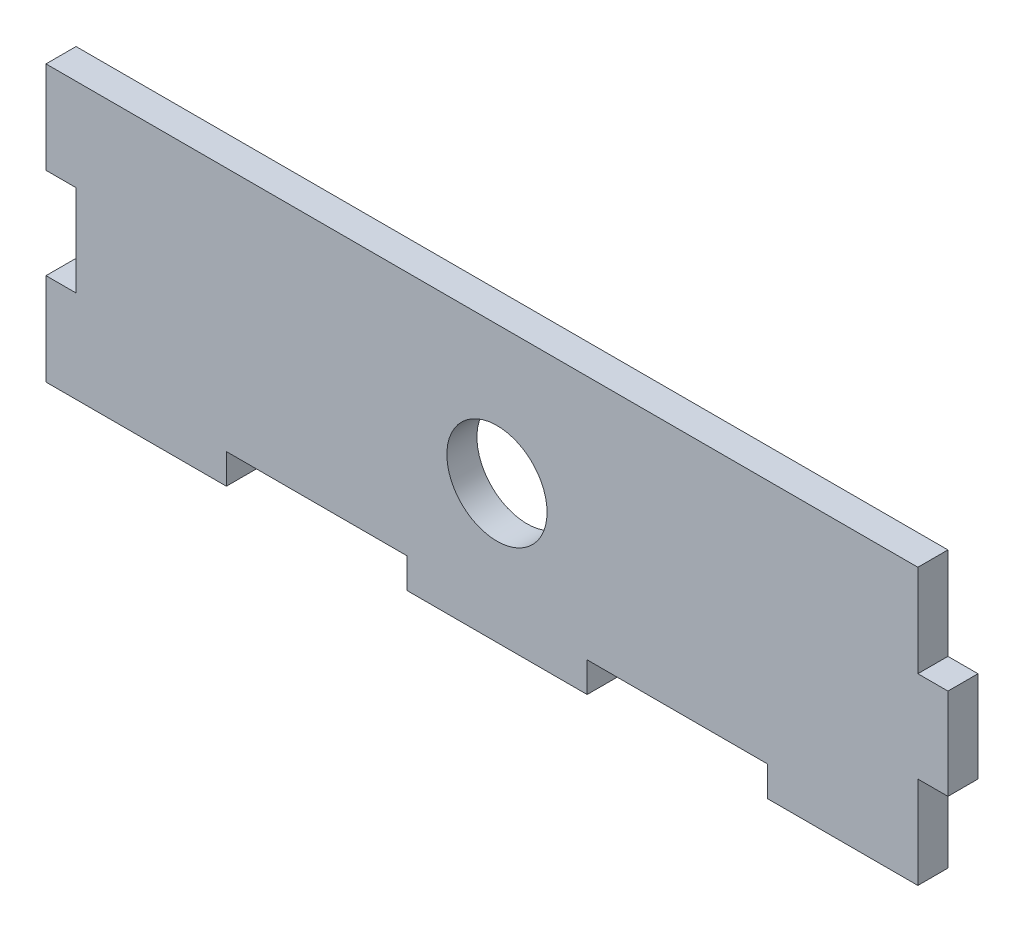
ISO-10303-21;
HEADER;
FILE_DESCRIPTION(('STEP AP214'),'2;1');
FILE_NAME('part.step','',(''),(''),'','','');
FILE_SCHEMA(('AUTOMOTIVE_DESIGN { 1 0 10303 214 1 1 1 1 }'));
ENDSEC;
DATA;
#1=APPLICATION_CONTEXT('core data for automotive mechanical design processes');
#2=APPLICATION_PROTOCOL_DEFINITION('international standard','automotive_design',2000,#1);
#3=PRODUCT_CONTEXT('',#1,'mechanical');
#4=PRODUCT('Part','Part','',(#3));
#5=PRODUCT_RELATED_PRODUCT_CATEGORY('part','',(#4));
#6=PRODUCT_DEFINITION_FORMATION('','',#4);
#7=PRODUCT_DEFINITION_CONTEXT('part definition',#1,'design');
#8=PRODUCT_DEFINITION('design','',#6,#7);
#9=PRODUCT_DEFINITION_SHAPE('','',#8);
#10=(LENGTH_UNIT() NAMED_UNIT(*) SI_UNIT(.MILLI.,.METRE.));
#11=(NAMED_UNIT(*) PLANE_ANGLE_UNIT() SI_UNIT($,.RADIAN.));
#12=(NAMED_UNIT(*) SI_UNIT($,.STERADIAN.) SOLID_ANGLE_UNIT());
#13=UNCERTAINTY_MEASURE_WITH_UNIT(LENGTH_MEASURE(1.E-05),#10,'distance_accuracy_value','');
#14=(GEOMETRIC_REPRESENTATION_CONTEXT(3) GLOBAL_UNCERTAINTY_ASSIGNED_CONTEXT((#13)) GLOBAL_UNIT_ASSIGNED_CONTEXT((#10,
#11,#12)) REPRESENTATION_CONTEXT('',''));
#15=CARTESIAN_POINT('',(0.,0.,0.));
#16=DIRECTION('',(0.,0.,1.));
#17=DIRECTION('',(1.,0.,0.));
#18=AXIS2_PLACEMENT_3D('',#15,#16,#17);
#19=CARTESIAN_POINT('',(9.00000000000001,0.,3.));
#20=DIRECTION('',(1.,0.,0.));
#21=DIRECTION('',(0.,0.,-1.));
#22=AXIS2_PLACEMENT_3D('',#19,#20,#21);
#23=PLANE('',#22);
#24=DIRECTION('',(0.,-1.,0.));
#25=VECTOR('',#24,1.);
#26=CARTESIAN_POINT('',(9.00000000000001,0.,0.));
#27=LINE('',#26,#25);
#28=CARTESIAN_POINT('',(9.00000000000001,-10.75,0.));
#29=VERTEX_POINT('',#28);
#30=CARTESIAN_POINT('',(9.00000000000001,-13.75,0.));
#31=VERTEX_POINT('',#30);
#32=EDGE_CURVE('E247',#29,#31,#27,.T.);
#33=ORIENTED_EDGE('',*,*,#32,.F.);
#34=DIRECTION('',(0.,0.,-1.));
#35=VECTOR('',#34,1.);
#36=CARTESIAN_POINT('',(9.00000000000001,-10.75,3.));
#37=LINE('',#36,#35);
#38=CARTESIAN_POINT('',(9.00000000000001,-10.75,3.));
#39=VERTEX_POINT('',#38);
#40=EDGE_CURVE('E11',#39,#29,#37,.T.);
#41=ORIENTED_EDGE('',*,*,#40,.F.);
#42=DIRECTION('',(0.,-1.,0.));
#43=VECTOR('',#42,1.);
#44=CARTESIAN_POINT('',(9.00000000000001,0.,3.));
#45=LINE('',#44,#43);
#46=CARTESIAN_POINT('',(9.00000000000001,-13.75,3.));
#47=VERTEX_POINT('',#46);
#48=EDGE_CURVE('E307',#39,#47,#45,.T.);
#49=ORIENTED_EDGE('',*,*,#48,.T.);
#50=DIRECTION('',(0.,0.,-1.));
#51=VECTOR('',#50,1.);
#52=CARTESIAN_POINT('',(9.00000000000001,-13.75,3.));
#53=LINE('',#52,#51);
#54=EDGE_CURVE('E121',#47,#31,#53,.T.);
#55=ORIENTED_EDGE('',*,*,#54,.T.);
#56=EDGE_LOOP('',(#33,#41,#49,#55));
#57=FACE_BOUND('',#56,.T.);
#58=ADVANCED_FACE('F34',(#57),#23,.T.);
#59=CARTESIAN_POINT('',(0.,-10.75,3.));
#60=DIRECTION('',(0.,-1.,0.));
#61=DIRECTION('',(1.,0.,0.));
#62=AXIS2_PLACEMENT_3D('',#59,#60,#61);
#63=PLANE('',#62);
#64=DIRECTION('',(-1.,0.,0.));
#65=VECTOR('',#64,1.);
#66=CARTESIAN_POINT('',(0.,-10.75,0.));
#67=LINE('',#66,#65);
#68=CARTESIAN_POINT('',(27.,-10.75,0.));
#69=VERTEX_POINT('',#68);
#70=EDGE_CURVE('E245',#69,#29,#67,.T.);
#71=ORIENTED_EDGE('',*,*,#70,.F.);
#72=DIRECTION('',(0.,0.,-1.));
#73=VECTOR('',#72,1.);
#74=CARTESIAN_POINT('',(27.,-10.75,3.));
#75=LINE('',#74,#73);
#76=CARTESIAN_POINT('',(27.,-10.75,3.));
#77=VERTEX_POINT('',#76);
#78=EDGE_CURVE('E43',#77,#69,#75,.T.);
#79=ORIENTED_EDGE('',*,*,#78,.F.);
#80=DIRECTION('',(-1.,0.,0.));
#81=VECTOR('',#80,1.);
#82=CARTESIAN_POINT('',(0.,-10.75,3.));
#83=LINE('',#82,#81);
#84=EDGE_CURVE('E306',#77,#39,#83,.T.);
#85=ORIENTED_EDGE('',*,*,#84,.T.);
#86=ORIENTED_EDGE('',*,*,#40,.T.);
#87=EDGE_LOOP('',(#71,#79,#85,#86));
#88=FACE_BOUND('',#87,.T.);
#89=ADVANCED_FACE('F246',(#88),#63,.T.);
#90=CARTESIAN_POINT('',(27.,0.,3.));
#91=DIRECTION('',(-1.,0.,0.));
#92=DIRECTION('',(0.,0.,1.));
#93=AXIS2_PLACEMENT_3D('',#90,#91,#92);
#94=PLANE('',#93);
#95=DIRECTION('',(0.,1.,0.));
#96=VECTOR('',#95,1.);
#97=CARTESIAN_POINT('',(27.,0.,0.));
#98=LINE('',#97,#96);
#99=CARTESIAN_POINT('',(27.,-13.75,0.));
#100=VERTEX_POINT('',#99);
#101=EDGE_CURVE('E238',#100,#69,#98,.T.);
#102=ORIENTED_EDGE('',*,*,#101,.F.);
#103=DIRECTION('',(0.,0.,-1.));
#104=VECTOR('',#103,1.);
#105=CARTESIAN_POINT('',(27.,-13.75,3.));
#106=LINE('',#105,#104);
#107=CARTESIAN_POINT('',(27.,-13.75,3.));
#108=VERTEX_POINT('',#107);
#109=EDGE_CURVE('E231',#108,#100,#106,.T.);
#110=ORIENTED_EDGE('',*,*,#109,.F.);
#111=DIRECTION('',(0.,1.,0.));
#112=VECTOR('',#111,1.);
#113=CARTESIAN_POINT('',(27.,0.,3.));
#114=LINE('',#113,#112);
#115=EDGE_CURVE('E240',#108,#77,#114,.T.);
#116=ORIENTED_EDGE('',*,*,#115,.T.);
#117=ORIENTED_EDGE('',*,*,#78,.T.);
#118=EDGE_LOOP('',(#102,#110,#116,#117));
#119=FACE_BOUND('',#118,.T.);
#120=ADVANCED_FACE('F236',(#119),#94,.T.);
#121=CARTESIAN_POINT('',(0.,-13.75,3.));
#122=DIRECTION('',(0.,1.,0.));
#123=DIRECTION('',(0.,0.,1.));
#124=AXIS2_PLACEMENT_3D('',#121,#122,#123);
#125=PLANE('',#124);
#126=DIRECTION('',(1.,0.,0.));
#127=VECTOR('',#126,1.);
#128=CARTESIAN_POINT('',(0.,-13.75,0.));
#129=LINE('',#128,#127);
#130=CARTESIAN_POINT('',(42.,-13.75,0.));
#131=VERTEX_POINT('',#130);
#132=EDGE_CURVE('E253',#100,#131,#129,.T.);
#133=ORIENTED_EDGE('',*,*,#132,.T.);
#134=DIRECTION('',(0.,0.,-1.));
#135=VECTOR('',#134,1.);
#136=CARTESIAN_POINT('',(42.,-13.75,3.));
#137=LINE('',#136,#135);
#138=CARTESIAN_POINT('',(42.,-13.75,3.));
#139=VERTEX_POINT('',#138);
#140=EDGE_CURVE('E229',#139,#131,#137,.T.);
#141=ORIENTED_EDGE('',*,*,#140,.F.);
#142=DIRECTION('',(1.,0.,0.));
#143=VECTOR('',#142,1.);
#144=CARTESIAN_POINT('',(0.,-13.75,3.));
#145=LINE('',#144,#143);
#146=EDGE_CURVE('E296',#108,#139,#145,.T.);
#147=ORIENTED_EDGE('',*,*,#146,.F.);
#148=ORIENTED_EDGE('',*,*,#109,.T.);
#149=EDGE_LOOP('',(#133,#141,#147,#148));
#150=FACE_BOUND('',#149,.T.);
#151=ADVANCED_FACE('F379',(#150),#125,.F.);
#152=CARTESIAN_POINT('',(42.,0.,3.));
#153=DIRECTION('',(1.,0.,0.));
#154=DIRECTION('',(0.,0.,-1.));
#155=AXIS2_PLACEMENT_3D('',#152,#153,#154);
#156=PLANE('',#155);
#157=DIRECTION('',(0.,-1.,0.));
#158=VECTOR('',#157,1.);
#159=CARTESIAN_POINT('',(42.,0.,0.));
#160=LINE('',#159,#158);
#161=CARTESIAN_POINT('',(42.,-4.55,0.));
#162=VERTEX_POINT('',#161);
#163=EDGE_CURVE('E255',#162,#131,#160,.T.);
#164=ORIENTED_EDGE('',*,*,#163,.F.);
#165=DIRECTION('',(0.,0.,-1.));
#166=VECTOR('',#165,1.);
#167=CARTESIAN_POINT('',(42.,-4.55,3.));
#168=LINE('',#167,#166);
#169=CARTESIAN_POINT('',(42.,-4.55,3.));
#170=VERTEX_POINT('',#169);
#171=EDGE_CURVE('E227',#170,#162,#168,.T.);
#172=ORIENTED_EDGE('',*,*,#171,.F.);
#173=DIRECTION('',(0.,-1.,0.));
#174=VECTOR('',#173,1.);
#175=CARTESIAN_POINT('',(42.,0.,3.));
#176=LINE('',#175,#174);
#177=EDGE_CURVE('E300',#170,#139,#176,.T.);
#178=ORIENTED_EDGE('',*,*,#177,.T.);
#179=ORIENTED_EDGE('',*,*,#140,.T.);
#180=EDGE_LOOP('',(#164,#172,#178,#179));
#181=FACE_BOUND('',#180,.T.);
#182=ADVANCED_FACE('F377',(#181),#156,.T.);
#183=CARTESIAN_POINT('',(0.,-4.55000000000001,3.));
#184=DIRECTION('',(0.,-1.,0.));
#185=DIRECTION('',(1.,0.,0.));
#186=AXIS2_PLACEMENT_3D('',#183,#184,#185);
#187=PLANE('',#186);
#188=DIRECTION('',(-1.,0.,0.));
#189=VECTOR('',#188,1.);
#190=CARTESIAN_POINT('',(0.,-4.55000000000001,0.));
#191=LINE('',#190,#189);
#192=CARTESIAN_POINT('',(45.,-4.55,0.));
#193=VERTEX_POINT('',#192);
#194=EDGE_CURVE('E261',#193,#162,#191,.T.);
#195=ORIENTED_EDGE('',*,*,#194,.F.);
#196=DIRECTION('',(0.,0.,-1.));
#197=VECTOR('',#196,1.);
#198=CARTESIAN_POINT('',(45.,-4.55,3.));
#199=LINE('',#198,#197);
#200=CARTESIAN_POINT('',(45.,-4.55,3.));
#201=VERTEX_POINT('',#200);
#202=EDGE_CURVE('E225',#201,#193,#199,.T.);
#203=ORIENTED_EDGE('',*,*,#202,.F.);
#204=DIRECTION('',(-1.,0.,0.));
#205=VECTOR('',#204,1.);
#206=CARTESIAN_POINT('',(0.,-4.55000000000001,3.));
#207=LINE('',#206,#205);
#208=EDGE_CURVE('E305',#201,#170,#207,.T.);
#209=ORIENTED_EDGE('',*,*,#208,.T.);
#210=ORIENTED_EDGE('',*,*,#171,.T.);
#211=EDGE_LOOP('',(#195,#203,#209,#210));
#212=FACE_BOUND('',#211,.T.);
#213=ADVANCED_FACE('F372',(#212),#187,.T.);
#214=CARTESIAN_POINT('',(45.,0.,3.));
#215=DIRECTION('',(-1.,0.,0.));
#216=DIRECTION('',(0.,0.,1.));
#217=AXIS2_PLACEMENT_3D('',#214,#215,#216);
#218=PLANE('',#217);
#219=DIRECTION('',(0.,1.,0.));
#220=VECTOR('',#219,1.);
#221=CARTESIAN_POINT('',(45.,0.,0.));
#222=LINE('',#221,#220);
#223=CARTESIAN_POINT('',(45.,4.55000000000001,0.));
#224=VERTEX_POINT('',#223);
#225=EDGE_CURVE('E264',#193,#224,#222,.T.);
#226=ORIENTED_EDGE('',*,*,#225,.T.);
#227=DIRECTION('',(0.,0.,-1.));
#228=VECTOR('',#227,1.);
#229=CARTESIAN_POINT('',(45.,4.55000000000001,3.));
#230=LINE('',#229,#228);
#231=CARTESIAN_POINT('',(45.,4.55000000000001,3.));
#232=VERTEX_POINT('',#231);
#233=EDGE_CURVE('E222',#232,#224,#230,.T.);
#234=ORIENTED_EDGE('',*,*,#233,.F.);
#235=DIRECTION('',(0.,1.,0.));
#236=VECTOR('',#235,1.);
#237=CARTESIAN_POINT('',(45.,0.,3.));
#238=LINE('',#237,#236);
#239=EDGE_CURVE('E581',#201,#232,#238,.T.);
#240=ORIENTED_EDGE('',*,*,#239,.F.);
#241=ORIENTED_EDGE('',*,*,#202,.T.);
#242=EDGE_LOOP('',(#226,#234,#240,#241));
#243=FACE_BOUND('',#242,.T.);
#244=ADVANCED_FACE('F369',(#243),#218,.F.);
#245=CARTESIAN_POINT('',(0.,4.55000000000017,3.));
#246=DIRECTION('',(0.,-1.,0.));
#247=DIRECTION('',(1.,0.,0.));
#248=AXIS2_PLACEMENT_3D('',#245,#246,#247);
#249=PLANE('',#248);
#250=DIRECTION('',(-1.,0.,0.));
#251=VECTOR('',#250,1.);
#252=CARTESIAN_POINT('',(0.,4.55000000000017,0.));
#253=LINE('',#252,#251);
#254=CARTESIAN_POINT('',(42.,4.55000000000001,0.));
#255=VERTEX_POINT('',#254);
#256=EDGE_CURVE('E267',#224,#255,#253,.T.);
#257=ORIENTED_EDGE('',*,*,#256,.T.);
#258=DIRECTION('',(0.,0.,-1.));
#259=VECTOR('',#258,1.);
#260=CARTESIAN_POINT('',(42.,4.55000000000001,3.));
#261=LINE('',#260,#259);
#262=CARTESIAN_POINT('',(42.,4.55000000000001,3.));
#263=VERTEX_POINT('',#262);
#264=EDGE_CURVE('E219',#263,#255,#261,.T.);
#265=ORIENTED_EDGE('',*,*,#264,.F.);
#266=DIRECTION('',(-1.,0.,0.));
#267=VECTOR('',#266,1.);
#268=CARTESIAN_POINT('',(0.,4.55000000000017,3.));
#269=LINE('',#268,#267);
#270=EDGE_CURVE('E365',#232,#263,#269,.T.);
#271=ORIENTED_EDGE('',*,*,#270,.F.);
#272=ORIENTED_EDGE('',*,*,#233,.T.);
#273=EDGE_LOOP('',(#257,#265,#271,#272));
#274=FACE_BOUND('',#273,.T.);
#275=ADVANCED_FACE('F363',(#274),#249,.F.);
#276=CARTESIAN_POINT('',(42.,0.,3.));
#277=DIRECTION('',(-1.,0.,0.));
#278=DIRECTION('',(0.,0.,1.));
#279=AXIS2_PLACEMENT_3D('',#276,#277,#278);
#280=PLANE('',#279);
#281=DIRECTION('',(0.,1.,0.));
#282=VECTOR('',#281,1.);
#283=CARTESIAN_POINT('',(42.,0.,0.));
#284=LINE('',#283,#282);
#285=CARTESIAN_POINT('',(42.,13.75,0.));
#286=VERTEX_POINT('',#285);
#287=EDGE_CURVE('E270',#255,#286,#284,.T.);
#288=ORIENTED_EDGE('',*,*,#287,.T.);
#289=DIRECTION('',(0.,0.,-1.));
#290=VECTOR('',#289,1.);
#291=CARTESIAN_POINT('',(42.,13.75,3.));
#292=LINE('',#291,#290);
#293=CARTESIAN_POINT('',(42.,13.75,3.));
#294=VERTEX_POINT('',#293);
#295=EDGE_CURVE('E217',#294,#286,#292,.T.);
#296=ORIENTED_EDGE('',*,*,#295,.F.);
#297=DIRECTION('',(0.,1.,0.));
#298=VECTOR('',#297,1.);
#299=CARTESIAN_POINT('',(42.,0.,3.));
#300=LINE('',#299,#298);
#301=EDGE_CURVE('E360',#263,#294,#300,.T.);
#302=ORIENTED_EDGE('',*,*,#301,.F.);
#303=ORIENTED_EDGE('',*,*,#264,.T.);
#304=EDGE_LOOP('',(#288,#296,#302,#303));
#305=FACE_BOUND('',#304,.T.);
#306=ADVANCED_FACE('F359',(#305),#280,.F.);
#307=CARTESIAN_POINT('',(0.,13.75,3.));
#308=DIRECTION('',(0.,1.,0.));
#309=DIRECTION('',(0.,0.,1.));
#310=AXIS2_PLACEMENT_3D('',#307,#308,#309);
#311=PLANE('',#310);
#312=DIRECTION('',(1.,0.,0.));
#313=VECTOR('',#312,1.);
#314=CARTESIAN_POINT('',(0.,13.75,0.));
#315=LINE('',#314,#313);
#316=CARTESIAN_POINT('',(-45.,13.75,0.));
#317=VERTEX_POINT('',#316);
#318=EDGE_CURVE('E273',#317,#286,#315,.T.);
#319=ORIENTED_EDGE('',*,*,#318,.F.);
#320=DIRECTION('',(0.,0.,-1.));
#321=VECTOR('',#320,1.);
#322=CARTESIAN_POINT('',(-45.,13.75,3.));
#323=LINE('',#322,#321);
#324=CARTESIAN_POINT('',(-45.,13.75,3.));
#325=VERTEX_POINT('',#324);
#326=EDGE_CURVE('E215',#325,#317,#323,.T.);
#327=ORIENTED_EDGE('',*,*,#326,.F.);
#328=DIRECTION('',(1.,0.,0.));
#329=VECTOR('',#328,1.);
#330=CARTESIAN_POINT('',(0.,13.75,3.));
#331=LINE('',#330,#329);
#332=EDGE_CURVE('E577',#325,#294,#331,.T.);
#333=ORIENTED_EDGE('',*,*,#332,.T.);
#334=ORIENTED_EDGE('',*,*,#295,.T.);
#335=EDGE_LOOP('',(#319,#327,#333,#334));
#336=FACE_BOUND('',#335,.T.);
#337=ADVANCED_FACE('F354',(#336),#311,.T.);
#338=CARTESIAN_POINT('',(-45.,0.,3.));
#339=DIRECTION('',(-1.,0.,0.));
#340=DIRECTION('',(0.,0.,1.));
#341=AXIS2_PLACEMENT_3D('',#338,#339,#340);
#342=PLANE('',#341);
#343=DIRECTION('',(0.,1.,0.));
#344=VECTOR('',#343,1.);
#345=CARTESIAN_POINT('',(-45.,0.,0.));
#346=LINE('',#345,#344);
#347=CARTESIAN_POINT('',(-45.,4.55,0.));
#348=VERTEX_POINT('',#347);
#349=EDGE_CURVE('E276',#348,#317,#346,.T.);
#350=ORIENTED_EDGE('',*,*,#349,.F.);
#351=DIRECTION('',(0.,0.,-1.));
#352=VECTOR('',#351,1.);
#353=CARTESIAN_POINT('',(-45.,4.55,3.));
#354=LINE('',#353,#352);
#355=CARTESIAN_POINT('',(-45.,4.55,3.));
#356=VERTEX_POINT('',#355);
#357=EDGE_CURVE('E213',#356,#348,#354,.T.);
#358=ORIENTED_EDGE('',*,*,#357,.F.);
#359=DIRECTION('',(0.,1.,0.));
#360=VECTOR('',#359,1.);
#361=CARTESIAN_POINT('',(-45.,0.,3.));
#362=LINE('',#361,#360);
#363=EDGE_CURVE('E350',#356,#325,#362,.T.);
#364=ORIENTED_EDGE('',*,*,#363,.T.);
#365=ORIENTED_EDGE('',*,*,#326,.T.);
#366=EDGE_LOOP('',(#350,#358,#364,#365));
#367=FACE_BOUND('',#366,.T.);
#368=ADVANCED_FACE('F348',(#367),#342,.T.);
#369=CARTESIAN_POINT('',(0.,4.55000000000001,3.));
#370=DIRECTION('',(0.,-1.,0.));
#371=DIRECTION('',(1.,0.,0.));
#372=AXIS2_PLACEMENT_3D('',#369,#370,#371);
#373=PLANE('',#372);
#374=DIRECTION('',(-1.,0.,0.));
#375=VECTOR('',#374,1.);
#376=CARTESIAN_POINT('',(0.,4.55000000000001,0.));
#377=LINE('',#376,#375);
#378=CARTESIAN_POINT('',(-42.,4.55,0.));
#379=VERTEX_POINT('',#378);
#380=EDGE_CURVE('E279',#379,#348,#377,.T.);
#381=ORIENTED_EDGE('',*,*,#380,.F.);
#382=DIRECTION('',(0.,0.,-1.));
#383=VECTOR('',#382,1.);
#384=CARTESIAN_POINT('',(-42.,4.55,3.));
#385=LINE('',#384,#383);
#386=CARTESIAN_POINT('',(-42.,4.55,3.));
#387=VERTEX_POINT('',#386);
#388=EDGE_CURVE('E211',#387,#379,#385,.T.);
#389=ORIENTED_EDGE('',*,*,#388,.F.);
#390=DIRECTION('',(-1.,0.,0.));
#391=VECTOR('',#390,1.);
#392=CARTESIAN_POINT('',(0.,4.55000000000001,3.));
#393=LINE('',#392,#391);
#394=EDGE_CURVE('E344',#387,#356,#393,.T.);
#395=ORIENTED_EDGE('',*,*,#394,.T.);
#396=ORIENTED_EDGE('',*,*,#357,.T.);
#397=EDGE_LOOP('',(#381,#389,#395,#396));
#398=FACE_BOUND('',#397,.T.);
#399=ADVANCED_FACE('F341',(#398),#373,.T.);
#400=CARTESIAN_POINT('',(-42.,0.,3.));
#401=DIRECTION('',(-1.,0.,0.));
#402=DIRECTION('',(0.,0.,1.));
#403=AXIS2_PLACEMENT_3D('',#400,#401,#402);
#404=PLANE('',#403);
#405=DIRECTION('',(0.,1.,0.));
#406=VECTOR('',#405,1.);
#407=CARTESIAN_POINT('',(-42.,0.,0.));
#408=LINE('',#407,#406);
#409=CARTESIAN_POINT('',(-42.,-4.55,0.));
#410=VERTEX_POINT('',#409);
#411=EDGE_CURVE('E283',#410,#379,#408,.T.);
#412=ORIENTED_EDGE('',*,*,#411,.F.);
#413=DIRECTION('',(0.,0.,-1.));
#414=VECTOR('',#413,1.);
#415=CARTESIAN_POINT('',(-42.,-4.55,3.));
#416=LINE('',#415,#414);
#417=CARTESIAN_POINT('',(-42.,-4.55,3.));
#418=VERTEX_POINT('',#417);
#419=EDGE_CURVE('E209',#418,#410,#416,.T.);
#420=ORIENTED_EDGE('',*,*,#419,.F.);
#421=DIRECTION('',(0.,1.,0.));
#422=VECTOR('',#421,1.);
#423=CARTESIAN_POINT('',(-42.,0.,3.));
#424=LINE('',#423,#422);
#425=EDGE_CURVE('E573',#418,#387,#424,.T.);
#426=ORIENTED_EDGE('',*,*,#425,.T.);
#427=ORIENTED_EDGE('',*,*,#388,.T.);
#428=EDGE_LOOP('',(#412,#420,#426,#427));
#429=FACE_BOUND('',#428,.T.);
#430=ADVANCED_FACE('F337',(#429),#404,.T.);
#431=CARTESIAN_POINT('',(0.,-4.55,3.));
#432=DIRECTION('',(0.,1.,0.));
#433=DIRECTION('',(0.,0.,1.));
#434=AXIS2_PLACEMENT_3D('',#431,#432,#433);
#435=PLANE('',#434);
#436=DIRECTION('',(1.,0.,0.));
#437=VECTOR('',#436,1.);
#438=CARTESIAN_POINT('',(0.,-4.55,0.));
#439=LINE('',#438,#437);
#440=CARTESIAN_POINT('',(-45.,-4.55,0.));
#441=VERTEX_POINT('',#440);
#442=EDGE_CURVE('E286',#441,#410,#439,.T.);
#443=ORIENTED_EDGE('',*,*,#442,.F.);
#444=DIRECTION('',(0.,0.,-1.));
#445=VECTOR('',#444,1.);
#446=CARTESIAN_POINT('',(-45.,-4.55,3.));
#447=LINE('',#446,#445);
#448=CARTESIAN_POINT('',(-45.,-4.55,3.));
#449=VERTEX_POINT('',#448);
#450=EDGE_CURVE('E207',#449,#441,#447,.T.);
#451=ORIENTED_EDGE('',*,*,#450,.F.);
#452=DIRECTION('',(1.,0.,0.));
#453=VECTOR('',#452,1.);
#454=CARTESIAN_POINT('',(0.,-4.55,3.));
#455=LINE('',#454,#453);
#456=EDGE_CURVE('E333',#449,#418,#455,.T.);
#457=ORIENTED_EDGE('',*,*,#456,.T.);
#458=ORIENTED_EDGE('',*,*,#419,.T.);
#459=EDGE_LOOP('',(#443,#451,#457,#458));
#460=FACE_BOUND('',#459,.T.);
#461=ADVANCED_FACE('F331',(#460),#435,.T.);
#462=CARTESIAN_POINT('',(-45.,-13.75,0.));
#463=VERTEX_POINT('',#462);
#464=EDGE_CURVE('E280',#463,#441,#346,.T.);
#465=ORIENTED_EDGE('',*,*,#464,.F.);
#466=DIRECTION('',(0.,0.,-1.));
#467=VECTOR('',#466,1.);
#468=CARTESIAN_POINT('',(-45.,-13.75,3.));
#469=LINE('',#468,#467);
#470=CARTESIAN_POINT('',(-45.,-13.75,3.));
#471=VERTEX_POINT('',#470);
#472=EDGE_CURVE('E205',#471,#463,#469,.T.);
#473=ORIENTED_EDGE('',*,*,#472,.F.);
#474=EDGE_CURVE('E299',#471,#449,#362,.T.);
#475=ORIENTED_EDGE('',*,*,#474,.T.);
#476=ORIENTED_EDGE('',*,*,#450,.T.);
#477=EDGE_LOOP('',(#465,#473,#475,#476));
#478=FACE_BOUND('',#477,.T.);
#479=ADVANCED_FACE('F324',(#478),#342,.T.);
#480=CARTESIAN_POINT('',(-27.,-13.75,0.));
#481=VERTEX_POINT('',#480);
#482=EDGE_CURVE('E257',#463,#481,#129,.T.);
#483=ORIENTED_EDGE('',*,*,#482,.T.);
#484=DIRECTION('',(0.,0.,-1.));
#485=VECTOR('',#484,1.);
#486=CARTESIAN_POINT('',(-27.,-13.75,3.));
#487=LINE('',#486,#485);
#488=CARTESIAN_POINT('',(-27.,-13.75,3.));
#489=VERTEX_POINT('',#488);
#490=EDGE_CURVE('E198',#489,#481,#487,.T.);
#491=ORIENTED_EDGE('',*,*,#490,.F.);
#492=EDGE_CURVE('E295',#471,#489,#145,.T.);
#493=ORIENTED_EDGE('',*,*,#492,.F.);
#494=ORIENTED_EDGE('',*,*,#472,.T.);
#495=EDGE_LOOP('',(#483,#491,#493,#494));
#496=FACE_BOUND('',#495,.T.);
#497=ADVANCED_FACE('F408',(#496),#125,.F.);
#498=CARTESIAN_POINT('',(-27.,0.,3.));
#499=DIRECTION('',(-1.,0.,0.));
#500=DIRECTION('',(0.,0.,1.));
#501=AXIS2_PLACEMENT_3D('',#498,#499,#500);
#502=PLANE('',#501);
#503=DIRECTION('',(0.,1.,0.));
#504=VECTOR('',#503,1.);
#505=CARTESIAN_POINT('',(-27.,0.,0.));
#506=LINE('',#505,#504);
#507=CARTESIAN_POINT('',(-27.,-10.75,0.));
#508=VERTEX_POINT('',#507);
#509=EDGE_CURVE('E289',#481,#508,#506,.T.);
#510=ORIENTED_EDGE('',*,*,#509,.T.);
#511=DIRECTION('',(0.,0.,-1.));
#512=VECTOR('',#511,1.);
#513=CARTESIAN_POINT('',(-27.,-10.75,3.));
#514=LINE('',#513,#512);
#515=CARTESIAN_POINT('',(-27.,-10.75,3.));
#516=VERTEX_POINT('',#515);
#517=EDGE_CURVE('E196',#516,#508,#514,.T.);
#518=ORIENTED_EDGE('',*,*,#517,.F.);
#519=DIRECTION('',(0.,1.,0.));
#520=VECTOR('',#519,1.);
#521=CARTESIAN_POINT('',(-27.,0.,3.));
#522=LINE('',#521,#520);
#523=EDGE_CURVE('E189',#489,#516,#522,.T.);
#524=ORIENTED_EDGE('',*,*,#523,.F.);
#525=ORIENTED_EDGE('',*,*,#490,.T.);
#526=EDGE_LOOP('',(#510,#518,#524,#525));
#527=FACE_BOUND('',#526,.T.);
#528=ADVANCED_FACE('F409',(#527),#502,.F.);
#529=CARTESIAN_POINT('',(0.,-10.75,3.));
#530=DIRECTION('',(0.,1.,0.));
#531=DIRECTION('',(0.,0.,1.));
#532=AXIS2_PLACEMENT_3D('',#529,#530,#531);
#533=PLANE('',#532);
#534=DIRECTION('',(1.,0.,0.));
#535=VECTOR('',#534,1.);
#536=CARTESIAN_POINT('',(0.,-10.75,0.));
#537=LINE('',#536,#535);
#538=CARTESIAN_POINT('',(-8.99999999999999,-10.75,0.));
#539=VERTEX_POINT('',#538);
#540=EDGE_CURVE('E195',#508,#539,#537,.T.);
#541=ORIENTED_EDGE('',*,*,#540,.T.);
#542=DIRECTION('',(0.,0.,-1.));
#543=VECTOR('',#542,1.);
#544=CARTESIAN_POINT('',(-8.99999999999999,-10.75,3.));
#545=LINE('',#544,#543);
#546=CARTESIAN_POINT('',(-8.99999999999999,-10.75,3.));
#547=VERTEX_POINT('',#546);
#548=EDGE_CURVE('E181',#547,#539,#545,.T.);
#549=ORIENTED_EDGE('',*,*,#548,.F.);
#550=DIRECTION('',(1.,0.,0.));
#551=VECTOR('',#550,1.);
#552=CARTESIAN_POINT('',(0.,-10.75,3.));
#553=LINE('',#552,#551);
#554=EDGE_CURVE('E184',#516,#547,#553,.T.);
#555=ORIENTED_EDGE('',*,*,#554,.F.);
#556=ORIENTED_EDGE('',*,*,#517,.T.);
#557=EDGE_LOOP('',(#541,#549,#555,#556));
#558=FACE_BOUND('',#557,.T.);
#559=ADVANCED_FACE('F194',(#558),#533,.F.);
#560=CARTESIAN_POINT('',(-8.99999999999998,0.,3.));
#561=DIRECTION('',(1.,0.,0.));
#562=DIRECTION('',(0.,1.,0.));
#563=AXIS2_PLACEMENT_3D('',#560,#561,#562);
#564=PLANE('',#563);
#565=DIRECTION('',(0.,-1.,0.));
#566=VECTOR('',#565,1.);
#567=CARTESIAN_POINT('',(-8.99999999999998,0.,0.));
#568=LINE('',#567,#566);
#569=CARTESIAN_POINT('',(-9.,-13.75,0.));
#570=VERTEX_POINT('',#569);
#571=EDGE_CURVE('E293',#539,#570,#568,.T.);
#572=ORIENTED_EDGE('',*,*,#571,.T.);
#573=DIRECTION('',(0.,0.,-1.));
#574=VECTOR('',#573,1.);
#575=CARTESIAN_POINT('',(-9.,-13.75,3.));
#576=LINE('',#575,#574);
#577=CARTESIAN_POINT('',(-9.,-13.75,3.));
#578=VERTEX_POINT('',#577);
#579=EDGE_CURVE('E183',#578,#570,#576,.T.);
#580=ORIENTED_EDGE('',*,*,#579,.F.);
#581=DIRECTION('',(0.,-1.,0.));
#582=VECTOR('',#581,1.);
#583=CARTESIAN_POINT('',(-8.99999999999998,0.,3.));
#584=LINE('',#583,#582);
#585=EDGE_CURVE('E176',#547,#578,#584,.T.);
#586=ORIENTED_EDGE('',*,*,#585,.F.);
#587=ORIENTED_EDGE('',*,*,#548,.T.);
#588=EDGE_LOOP('',(#572,#580,#586,#587));
#589=FACE_BOUND('',#588,.T.);
#590=ADVANCED_FACE('F179',(#589),#564,.F.);
#591=CARTESIAN_POINT('',(0.,0.,3.));
#592=DIRECTION('',(0.,0.,-1.));
#593=DIRECTION('',(-1.,0.,0.));
#594=AXIS2_PLACEMENT_3D('',#591,#592,#593);
#595=CYLINDRICAL_SURFACE('',#594,5.);
#596=CARTESIAN_POINT('',(0.,0.,3.));
#597=DIRECTION('',(0.,0.,1.));
#598=DIRECTION('',(1.,0.,0.));
#599=AXIS2_PLACEMENT_3D('',#596,#597,#598);
#600=CIRCLE('',#599,5.);
#601=CARTESIAN_POINT('',(5.,0.,3.));
#602=VERTEX_POINT('',#601);
#603=EDGE_CURVE('E311',#602,#602,#600,.T.);
#604=ORIENTED_EDGE('',*,*,#603,.T.);
#605=EDGE_LOOP('',(#604));
#606=FACE_BOUND('',#605,.T.);
#607=CARTESIAN_POINT('',(0.,0.,0.));
#608=DIRECTION('',(0.,0.,1.));
#609=DIRECTION('',(1.,0.,0.));
#610=AXIS2_PLACEMENT_3D('',#607,#608,#609);
#611=CIRCLE('',#610,5.);
#612=CARTESIAN_POINT('',(5.,0.,0.));
#613=VERTEX_POINT('',#612);
#614=EDGE_CURVE('E568',#613,#613,#611,.T.);
#615=ORIENTED_EDGE('',*,*,#614,.F.);
#616=EDGE_LOOP('',(#615));
#617=FACE_BOUND('',#616,.T.);
#618=ADVANCED_FACE('F36',(#606,#617),#595,.F.);
#619=EDGE_CURVE('E114',#570,#31,#129,.T.);
#620=ORIENTED_EDGE('',*,*,#619,.T.);
#621=ORIENTED_EDGE('',*,*,#54,.F.);
#622=EDGE_CURVE('E51',#578,#47,#145,.T.);
#623=ORIENTED_EDGE('',*,*,#622,.F.);
#624=ORIENTED_EDGE('',*,*,#579,.T.);
#625=EDGE_LOOP('',(#620,#621,#623,#624));
#626=FACE_BOUND('',#625,.T.);
#627=ADVANCED_FACE('F417',(#626),#125,.F.);
#628=CARTESIAN_POINT('',(0.,0.,3.));
#629=DIRECTION('',(0.,0.,1.));
#630=DIRECTION('',(1.,0.,0.));
#631=AXIS2_PLACEMENT_3D('',#628,#629,#630);
#632=PLANE('',#631);
#633=ORIENTED_EDGE('',*,*,#603,.F.);
#634=EDGE_LOOP('',(#633));
#635=FACE_BOUND('',#634,.T.);
#636=ORIENTED_EDGE('',*,*,#48,.F.);
#637=ORIENTED_EDGE('',*,*,#84,.F.);
#638=ORIENTED_EDGE('',*,*,#115,.F.);
#639=ORIENTED_EDGE('',*,*,#146,.T.);
#640=ORIENTED_EDGE('',*,*,#177,.F.);
#641=ORIENTED_EDGE('',*,*,#208,.F.);
#642=ORIENTED_EDGE('',*,*,#239,.T.);
#643=ORIENTED_EDGE('',*,*,#270,.T.);
#644=ORIENTED_EDGE('',*,*,#301,.T.);
#645=ORIENTED_EDGE('',*,*,#332,.F.);
#646=ORIENTED_EDGE('',*,*,#363,.F.);
#647=ORIENTED_EDGE('',*,*,#394,.F.);
#648=ORIENTED_EDGE('',*,*,#425,.F.);
#649=ORIENTED_EDGE('',*,*,#456,.F.);
#650=ORIENTED_EDGE('',*,*,#474,.F.);
#651=ORIENTED_EDGE('',*,*,#492,.T.);
#652=ORIENTED_EDGE('',*,*,#523,.T.);
#653=ORIENTED_EDGE('',*,*,#554,.T.);
#654=ORIENTED_EDGE('',*,*,#585,.T.);
#655=ORIENTED_EDGE('',*,*,#622,.T.);
#656=EDGE_LOOP('',(#636,#637,#638,#639,#640,#641,#642,#643,#644,#645,#646,#647,#648,#649,#650,
#651,#652,#653,#654,#655));
#657=FACE_BOUND('',#656,.T.);
#658=ADVANCED_FACE('F187',(#635,#657),#632,.T.);
#659=CARTESIAN_POINT('',(0.,0.,0.));
#660=DIRECTION('',(0.,0.,1.));
#661=DIRECTION('',(1.,0.,0.));
#662=AXIS2_PLACEMENT_3D('',#659,#660,#661);
#663=PLANE('',#662);
#664=ORIENTED_EDGE('',*,*,#614,.T.);
#665=EDGE_LOOP('',(#664));
#666=FACE_BOUND('',#665,.T.);
#667=ORIENTED_EDGE('',*,*,#32,.T.);
#668=ORIENTED_EDGE('',*,*,#619,.F.);
#669=ORIENTED_EDGE('',*,*,#571,.F.);
#670=ORIENTED_EDGE('',*,*,#540,.F.);
#671=ORIENTED_EDGE('',*,*,#509,.F.);
#672=ORIENTED_EDGE('',*,*,#482,.F.);
#673=ORIENTED_EDGE('',*,*,#464,.T.);
#674=ORIENTED_EDGE('',*,*,#442,.T.);
#675=ORIENTED_EDGE('',*,*,#411,.T.);
#676=ORIENTED_EDGE('',*,*,#380,.T.);
#677=ORIENTED_EDGE('',*,*,#349,.T.);
#678=ORIENTED_EDGE('',*,*,#318,.T.);
#679=ORIENTED_EDGE('',*,*,#287,.F.);
#680=ORIENTED_EDGE('',*,*,#256,.F.);
#681=ORIENTED_EDGE('',*,*,#225,.F.);
#682=ORIENTED_EDGE('',*,*,#194,.T.);
#683=ORIENTED_EDGE('',*,*,#163,.T.);
#684=ORIENTED_EDGE('',*,*,#132,.F.);
#685=ORIENTED_EDGE('',*,*,#101,.T.);
#686=ORIENTED_EDGE('',*,*,#70,.T.);
#687=EDGE_LOOP('',(#667,#668,#669,#670,#671,#672,#673,#674,#675,#676,#677,#678,#679,#680,#681,
#682,#683,#684,#685,#686));
#688=FACE_BOUND('',#687,.T.);
#689=ADVANCED_FACE('F250',(#666,#688),#663,.F.);
#690=CLOSED_SHELL('',(#58,#89,#120,#151,#182,#213,#244,#275,#306,#337,#368,#399,#430,#461,#479,
#497,#528,#559,#590,#618,#627,#658,#689));
#691=MANIFOLD_SOLID_BREP('B2',#690);
#692=ADVANCED_BREP_SHAPE_REPRESENTATION('',(#18,#691),#14);
#693=SHAPE_DEFINITION_REPRESENTATION(#9,#692);
ENDSEC;
END-ISO-10303-21;
